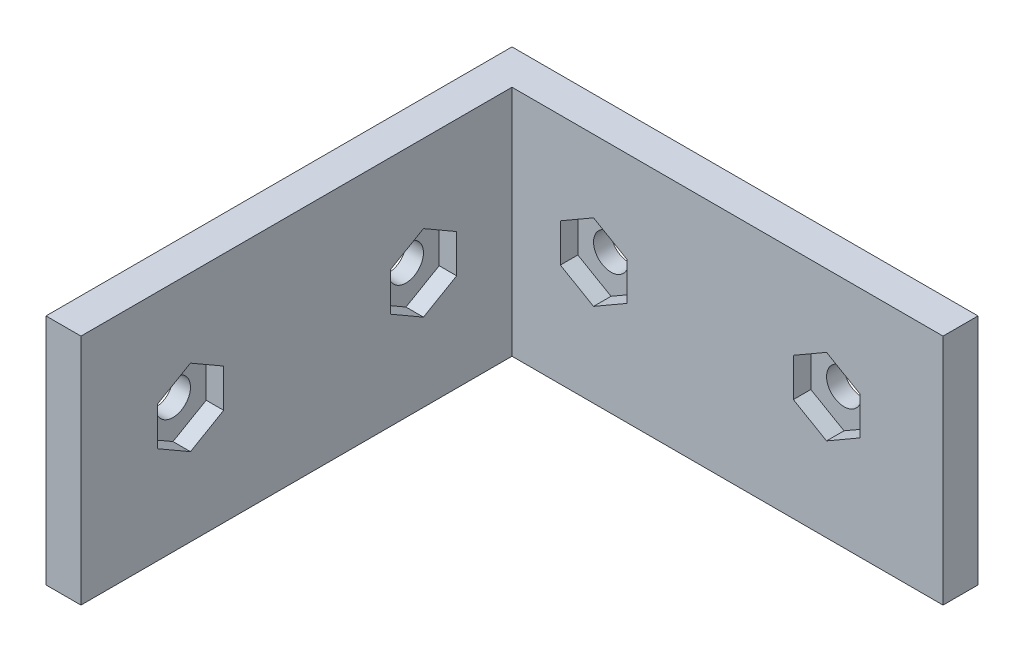
ISO-10303-21;
HEADER;
FILE_DESCRIPTION(('STEP AP214'),'2;1');
FILE_NAME('part.step','',(''),(''),'','','');
FILE_SCHEMA(('AUTOMOTIVE_DESIGN { 1 0 10303 214 1 1 1 1 }'));
ENDSEC;
DATA;
#1=APPLICATION_CONTEXT('core data for automotive mechanical design processes');
#2=APPLICATION_PROTOCOL_DEFINITION('international standard','automotive_design',2000,#1);
#3=PRODUCT_CONTEXT('',#1,'mechanical');
#4=PRODUCT('Part','Part','',(#3));
#5=PRODUCT_RELATED_PRODUCT_CATEGORY('part','',(#4));
#6=PRODUCT_DEFINITION_FORMATION('','',#4);
#7=PRODUCT_DEFINITION_CONTEXT('part definition',#1,'design');
#8=PRODUCT_DEFINITION('design','',#6,#7);
#9=PRODUCT_DEFINITION_SHAPE('','',#8);
#10=(LENGTH_UNIT() NAMED_UNIT(*) SI_UNIT(.MILLI.,.METRE.));
#11=(NAMED_UNIT(*) PLANE_ANGLE_UNIT() SI_UNIT($,.RADIAN.));
#12=(NAMED_UNIT(*) SI_UNIT($,.STERADIAN.) SOLID_ANGLE_UNIT());
#13=UNCERTAINTY_MEASURE_WITH_UNIT(LENGTH_MEASURE(1.E-05),#10,'distance_accuracy_value','');
#14=(GEOMETRIC_REPRESENTATION_CONTEXT(3) GLOBAL_UNCERTAINTY_ASSIGNED_CONTEXT((#13)) GLOBAL_UNIT_ASSIGNED_CONTEXT((#10,
#11,#12)) REPRESENTATION_CONTEXT('',''));
#15=CARTESIAN_POINT('',(0.,0.,0.));
#16=DIRECTION('',(0.,0.,1.));
#17=DIRECTION('',(1.,0.,0.));
#18=AXIS2_PLACEMENT_3D('',#15,#16,#17);
#19=CARTESIAN_POINT('',(10.,10.5,0.));
#20=DIRECTION('',(0.,0.,1.));
#21=DIRECTION('',(1.,0.,0.));
#22=AXIS2_PLACEMENT_3D('',#19,#20,#21);
#23=CYLINDRICAL_SURFACE('',#22,1.5);
#24=CARTESIAN_POINT('',(10.,10.5,0.));
#25=DIRECTION('',(0.,0.,1.));
#26=DIRECTION('',(1.,0.,0.));
#27=AXIS2_PLACEMENT_3D('',#24,#25,#26);
#28=CIRCLE('',#27,1.5);
#29=CARTESIAN_POINT('',(11.5,10.5,0.));
#30=VERTEX_POINT('',#29);
#31=EDGE_CURVE('E460',#30,#30,#28,.T.);
#32=ORIENTED_EDGE('',*,*,#31,.F.);
#33=EDGE_LOOP('',(#32));
#34=FACE_BOUND('',#33,.T.);
#35=CARTESIAN_POINT('',(10.,10.5,1.5));
#36=DIRECTION('',(0.,0.,1.));
#37=DIRECTION('',(1.,0.,0.));
#38=AXIS2_PLACEMENT_3D('',#35,#36,#37);
#39=CIRCLE('',#38,1.5);
#40=CARTESIAN_POINT('',(11.5,10.5,1.5));
#41=VERTEX_POINT('',#40);
#42=EDGE_CURVE('E37',#41,#41,#39,.F.);
#43=ORIENTED_EDGE('',*,*,#42,.F.);
#44=EDGE_LOOP('',(#43));
#45=FACE_BOUND('',#44,.T.);
#46=ADVANCED_FACE('F33',(#34,#45),#23,.F.);
#47=CARTESIAN_POINT('',(30.,10.5,0.));
#48=DIRECTION('',(0.,0.,1.));
#49=DIRECTION('',(1.,0.,0.));
#50=AXIS2_PLACEMENT_3D('',#47,#48,#49);
#51=CYLINDRICAL_SURFACE('',#50,1.5);
#52=CARTESIAN_POINT('',(30.,10.5,0.));
#53=DIRECTION('',(0.,0.,1.));
#54=DIRECTION('',(1.,0.,0.));
#55=AXIS2_PLACEMENT_3D('',#52,#53,#54);
#56=CIRCLE('',#55,1.5);
#57=CARTESIAN_POINT('',(31.5,10.5,0.));
#58=VERTEX_POINT('',#57);
#59=EDGE_CURVE('E457',#58,#58,#56,.T.);
#60=ORIENTED_EDGE('',*,*,#59,.F.);
#61=EDGE_LOOP('',(#60));
#62=FACE_BOUND('',#61,.T.);
#63=CARTESIAN_POINT('',(30.,10.5,1.5));
#64=DIRECTION('',(0.,0.,1.));
#65=DIRECTION('',(1.,0.,0.));
#66=AXIS2_PLACEMENT_3D('',#63,#64,#65);
#67=CIRCLE('',#66,1.5);
#68=CARTESIAN_POINT('',(31.5,10.5,1.5));
#69=VERTEX_POINT('',#68);
#70=EDGE_CURVE('E324',#69,#69,#67,.F.);
#71=ORIENTED_EDGE('',*,*,#70,.F.);
#72=EDGE_LOOP('',(#71));
#73=FACE_BOUND('',#72,.T.);
#74=ADVANCED_FACE('F494',(#62,#73),#51,.F.);
#75=CARTESIAN_POINT('',(3.,10.,30.6));
#76=DIRECTION('',(-1.,0.,0.));
#77=DIRECTION('',(0.,0.,1.));
#78=AXIS2_PLACEMENT_3D('',#75,#76,#77);
#79=CYLINDRICAL_SURFACE('',#78,1.5);
#80=CARTESIAN_POINT('',(0.,10.,30.6));
#81=DIRECTION('',(-1.,0.,0.));
#82=DIRECTION('',(0.,0.,1.));
#83=AXIS2_PLACEMENT_3D('',#80,#81,#82);
#84=CIRCLE('',#83,1.5);
#85=CARTESIAN_POINT('',(0.,10.,32.1));
#86=VERTEX_POINT('',#85);
#87=EDGE_CURVE('E432',#86,#86,#84,.T.);
#88=ORIENTED_EDGE('',*,*,#87,.T.);
#89=EDGE_LOOP('',(#88));
#90=FACE_BOUND('',#89,.T.);
#91=CARTESIAN_POINT('',(1.5,10.,30.6));
#92=DIRECTION('',(1.,0.,0.));
#93=DIRECTION('',(0.,1.,0.));
#94=AXIS2_PLACEMENT_3D('',#91,#92,#93);
#95=CIRCLE('',#94,1.5);
#96=CARTESIAN_POINT('',(1.5,11.5,30.6));
#97=VERTEX_POINT('',#96);
#98=EDGE_CURVE('E372',#97,#97,#95,.F.);
#99=ORIENTED_EDGE('',*,*,#98,.F.);
#100=EDGE_LOOP('',(#99));
#101=FACE_BOUND('',#100,.T.);
#102=ADVANCED_FACE('F496',(#90,#101),#79,.F.);
#103=CARTESIAN_POINT('',(3.,10.,10.6));
#104=DIRECTION('',(-1.,0.,0.));
#105=DIRECTION('',(0.,0.,1.));
#106=AXIS2_PLACEMENT_3D('',#103,#104,#105);
#107=CYLINDRICAL_SURFACE('',#106,1.5);
#108=CARTESIAN_POINT('',(0.,10.,10.6));
#109=DIRECTION('',(-1.,0.,0.));
#110=DIRECTION('',(0.,0.,1.));
#111=AXIS2_PLACEMENT_3D('',#108,#109,#110);
#112=CIRCLE('',#111,1.5);
#113=CARTESIAN_POINT('',(0.,10.,12.1));
#114=VERTEX_POINT('',#113);
#115=EDGE_CURVE('E435',#114,#114,#112,.T.);
#116=ORIENTED_EDGE('',*,*,#115,.T.);
#117=EDGE_LOOP('',(#116));
#118=FACE_BOUND('',#117,.T.);
#119=CARTESIAN_POINT('',(1.5,10.,10.6));
#120=DIRECTION('',(1.,0.,0.));
#121=DIRECTION('',(0.,0.,-1.));
#122=AXIS2_PLACEMENT_3D('',#119,#120,#121);
#123=CIRCLE('',#122,1.5);
#124=CARTESIAN_POINT('',(1.5,10.,9.1));
#125=VERTEX_POINT('',#124);
#126=EDGE_CURVE('E421',#125,#125,#123,.F.);
#127=ORIENTED_EDGE('',*,*,#126,.F.);
#128=EDGE_LOOP('',(#127));
#129=FACE_BOUND('',#128,.T.);
#130=ADVANCED_FACE('F504',(#118,#129),#107,.F.);
#131=CARTESIAN_POINT('',(0.,0.,3.));
#132=DIRECTION('',(0.,0.,-1.));
#133=DIRECTION('',(-1.,0.,0.));
#134=AXIS2_PLACEMENT_3D('',#131,#132,#133);
#135=PLANE('',#134);
#136=DIRECTION('',(0.866025403784439,0.5,0.));
#137=VECTOR('',#136,1.);
#138=CARTESIAN_POINT('',(10.,7.20910346561913,3.));
#139=LINE('',#138,#137);
#140=CARTESIAN_POINT('',(10.,7.20910346561913,3.));
#141=VERTEX_POINT('',#140);
#142=CARTESIAN_POINT('',(12.85,8.85455173280957,3.));
#143=VERTEX_POINT('',#142);
#144=EDGE_CURVE('E268',#141,#143,#139,.T.);
#145=ORIENTED_EDGE('',*,*,#144,.F.);
#146=DIRECTION('',(0.866025403784439,-0.5,0.));
#147=VECTOR('',#146,1.);
#148=CARTESIAN_POINT('',(7.15,8.85455173280957,3.));
#149=LINE('',#148,#147);
#150=CARTESIAN_POINT('',(7.15,8.85455173280957,3.));
#151=VERTEX_POINT('',#150);
#152=EDGE_CURVE('E50',#151,#141,#149,.T.);
#153=ORIENTED_EDGE('',*,*,#152,.F.);
#154=DIRECTION('',(0.,-1.,0.));
#155=VECTOR('',#154,1.);
#156=CARTESIAN_POINT('',(7.15,12.1454482671904,3.));
#157=LINE('',#156,#155);
#158=CARTESIAN_POINT('',(7.15,12.1454482671904,3.));
#159=VERTEX_POINT('',#158);
#160=EDGE_CURVE('E254',#159,#151,#157,.T.);
#161=ORIENTED_EDGE('',*,*,#160,.F.);
#162=DIRECTION('',(-0.866025403784439,-0.5,0.));
#163=VECTOR('',#162,1.);
#164=CARTESIAN_POINT('',(10.,13.7908965343809,3.));
#165=LINE('',#164,#163);
#166=CARTESIAN_POINT('',(10.,13.7908965343809,3.));
#167=VERTEX_POINT('',#166);
#168=EDGE_CURVE('E257',#167,#159,#165,.T.);
#169=ORIENTED_EDGE('',*,*,#168,.F.);
#170=DIRECTION('',(-0.866025403784439,0.5,0.));
#171=VECTOR('',#170,1.);
#172=CARTESIAN_POINT('',(12.85,12.1454482671904,3.));
#173=LINE('',#172,#171);
#174=CARTESIAN_POINT('',(12.85,12.1454482671904,3.));
#175=VERTEX_POINT('',#174);
#176=EDGE_CURVE('E273',#175,#167,#173,.T.);
#177=ORIENTED_EDGE('',*,*,#176,.F.);
#178=DIRECTION('',(0.,1.,0.));
#179=VECTOR('',#178,1.);
#180=CARTESIAN_POINT('',(12.85,8.85455173280957,3.));
#181=LINE('',#180,#179);
#182=EDGE_CURVE('E270',#143,#175,#181,.T.);
#183=ORIENTED_EDGE('',*,*,#182,.F.);
#184=EDGE_LOOP('',(#145,#153,#161,#169,#177,#183));
#185=FACE_BOUND('',#184,.T.);
#186=DIRECTION('',(0.866025403784439,-0.5,0.));
#187=VECTOR('',#186,1.);
#188=CARTESIAN_POINT('',(27.15,8.85455173280957,3.));
#189=LINE('',#188,#187);
#190=CARTESIAN_POINT('',(27.15,8.85455173280957,3.));
#191=VERTEX_POINT('',#190);
#192=CARTESIAN_POINT('',(30.,7.20910346561913,3.));
#193=VERTEX_POINT('',#192);
#194=EDGE_CURVE('E308',#191,#193,#189,.T.);
#195=ORIENTED_EDGE('',*,*,#194,.F.);
#196=DIRECTION('',(0.,-1.,0.));
#197=VECTOR('',#196,1.);
#198=CARTESIAN_POINT('',(27.15,12.1454482671904,3.));
#199=LINE('',#198,#197);
#200=CARTESIAN_POINT('',(27.15,12.1454482671904,3.));
#201=VERTEX_POINT('',#200);
#202=EDGE_CURVE('E58',#201,#191,#199,.T.);
#203=ORIENTED_EDGE('',*,*,#202,.F.);
#204=DIRECTION('',(-0.866025403784438,-0.5,0.));
#205=VECTOR('',#204,1.);
#206=CARTESIAN_POINT('',(30.,13.7908965343809,3.));
#207=LINE('',#206,#205);
#208=CARTESIAN_POINT('',(30.,13.7908965343809,3.));
#209=VERTEX_POINT('',#208);
#210=EDGE_CURVE('E291',#209,#201,#207,.T.);
#211=ORIENTED_EDGE('',*,*,#210,.F.);
#212=DIRECTION('',(-0.866025403784439,0.5,0.));
#213=VECTOR('',#212,1.);
#214=CARTESIAN_POINT('',(32.85,12.1454482671904,3.));
#215=LINE('',#214,#213);
#216=CARTESIAN_POINT('',(32.85,12.1454482671904,3.));
#217=VERTEX_POINT('',#216);
#218=EDGE_CURVE('E317',#217,#209,#215,.T.);
#219=ORIENTED_EDGE('',*,*,#218,.F.);
#220=DIRECTION('',(0.,1.,0.));
#221=VECTOR('',#220,1.);
#222=CARTESIAN_POINT('',(32.85,8.85455173280957,3.));
#223=LINE('',#222,#221);
#224=CARTESIAN_POINT('',(32.85,8.85455173280957,3.));
#225=VERTEX_POINT('',#224);
#226=EDGE_CURVE('E314',#225,#217,#223,.T.);
#227=ORIENTED_EDGE('',*,*,#226,.F.);
#228=DIRECTION('',(0.866025403784439,0.5,0.));
#229=VECTOR('',#228,1.);
#230=CARTESIAN_POINT('',(30.,7.20910346561913,3.));
#231=LINE('',#230,#229);
#232=EDGE_CURVE('E311',#193,#225,#231,.T.);
#233=ORIENTED_EDGE('',*,*,#232,.F.);
#234=EDGE_LOOP('',(#195,#203,#211,#219,#227,#233));
#235=FACE_BOUND('',#234,.T.);
#236=DIRECTION('',(0.,1.,0.));
#237=VECTOR('',#236,1.);
#238=CARTESIAN_POINT('',(3.,20.,3.));
#239=LINE('',#238,#237);
#240=CARTESIAN_POINT('',(3.,0.,3.));
#241=VERTEX_POINT('',#240);
#242=CARTESIAN_POINT('',(3.,20.,3.));
#243=VERTEX_POINT('',#242);
#244=EDGE_CURVE('E438',#241,#243,#239,.T.);
#245=ORIENTED_EDGE('',*,*,#244,.F.);
#246=DIRECTION('',(1.,0.,0.));
#247=VECTOR('',#246,1.);
#248=CARTESIAN_POINT('',(0.,0.,3.));
#249=LINE('',#248,#247);
#250=CARTESIAN_POINT('',(40.,0.,3.));
#251=VERTEX_POINT('',#250);
#252=EDGE_CURVE('E464',#241,#251,#249,.T.);
#253=ORIENTED_EDGE('',*,*,#252,.T.);
#254=DIRECTION('',(0.,1.,0.));
#255=VECTOR('',#254,1.);
#256=CARTESIAN_POINT('',(40.,0.,3.));
#257=LINE('',#256,#255);
#258=CARTESIAN_POINT('',(40.,20.,3.));
#259=VERTEX_POINT('',#258);
#260=EDGE_CURVE('E466',#251,#259,#257,.T.);
#261=ORIENTED_EDGE('',*,*,#260,.T.);
#262=DIRECTION('',(-1.,0.,0.));
#263=VECTOR('',#262,1.);
#264=CARTESIAN_POINT('',(0.,20.,3.));
#265=LINE('',#264,#263);
#266=EDGE_CURVE('E469',#259,#243,#265,.T.);
#267=ORIENTED_EDGE('',*,*,#266,.T.);
#268=EDGE_LOOP('',(#245,#253,#261,#267));
#269=FACE_BOUND('',#268,.T.);
#270=ADVANCED_FACE('F514',(#185,#235,#269),#135,.F.);
#271=CARTESIAN_POINT('',(0.,0.,3.));
#272=DIRECTION('',(1.,0.,0.));
#273=DIRECTION('',(0.,0.,-1.));
#274=AXIS2_PLACEMENT_3D('',#271,#272,#273);
#275=PLANE('',#274);
#276=ORIENTED_EDGE('',*,*,#87,.F.);
#277=EDGE_LOOP('',(#276));
#278=FACE_BOUND('',#277,.T.);
#279=ORIENTED_EDGE('',*,*,#115,.F.);
#280=EDGE_LOOP('',(#279));
#281=FACE_BOUND('',#280,.T.);
#282=DIRECTION('',(0.,-1.,0.));
#283=VECTOR('',#282,1.);
#284=CARTESIAN_POINT('',(0.,0.,0.));
#285=LINE('',#284,#283);
#286=CARTESIAN_POINT('',(0.,20.,0.));
#287=VERTEX_POINT('',#286);
#288=CARTESIAN_POINT('',(0.,0.,0.));
#289=VERTEX_POINT('',#288);
#290=EDGE_CURVE('E463',#287,#289,#285,.T.);
#291=ORIENTED_EDGE('',*,*,#290,.T.);
#292=DIRECTION('',(0.,0.,-1.));
#293=VECTOR('',#292,1.);
#294=CARTESIAN_POINT('',(0.,0.,3.));
#295=LINE('',#294,#293);
#296=CARTESIAN_POINT('',(0.,0.,40.));
#297=VERTEX_POINT('',#296);
#298=EDGE_CURVE('E11',#297,#289,#295,.T.);
#299=ORIENTED_EDGE('',*,*,#298,.F.);
#300=DIRECTION('',(0.,-1.,0.));
#301=VECTOR('',#300,1.);
#302=CARTESIAN_POINT('',(0.,20.,40.));
#303=LINE('',#302,#301);
#304=CARTESIAN_POINT('',(0.,20.,40.));
#305=VERTEX_POINT('',#304);
#306=EDGE_CURVE('E439',#305,#297,#303,.T.);
#307=ORIENTED_EDGE('',*,*,#306,.F.);
#308=DIRECTION('',(0.,0.,-1.));
#309=VECTOR('',#308,1.);
#310=CARTESIAN_POINT('',(0.,20.,3.));
#311=LINE('',#310,#309);
#312=EDGE_CURVE('E471',#305,#287,#311,.T.);
#313=ORIENTED_EDGE('',*,*,#312,.T.);
#314=EDGE_LOOP('',(#291,#299,#307,#313));
#315=FACE_BOUND('',#314,.T.);
#316=ADVANCED_FACE('F35',(#278,#281,#315),#275,.F.);
#317=CARTESIAN_POINT('',(0.,0.,3.));
#318=DIRECTION('',(0.,1.,0.));
#319=DIRECTION('',(0.,0.,1.));
#320=AXIS2_PLACEMENT_3D('',#317,#318,#319);
#321=PLANE('',#320);
#322=DIRECTION('',(1.,0.,0.));
#323=VECTOR('',#322,1.);
#324=CARTESIAN_POINT('',(0.,0.,0.));
#325=LINE('',#324,#323);
#326=CARTESIAN_POINT('',(40.,0.,0.));
#327=VERTEX_POINT('',#326);
#328=EDGE_CURVE('E474',#289,#327,#325,.T.);
#329=ORIENTED_EDGE('',*,*,#328,.T.);
#330=DIRECTION('',(0.,0.,-1.));
#331=VECTOR('',#330,1.);
#332=CARTESIAN_POINT('',(40.,0.,3.));
#333=LINE('',#332,#331);
#334=EDGE_CURVE('E42',#251,#327,#333,.T.);
#335=ORIENTED_EDGE('',*,*,#334,.F.);
#336=ORIENTED_EDGE('',*,*,#252,.F.);
#337=DIRECTION('',(0.,0.,-1.));
#338=VECTOR('',#337,1.);
#339=CARTESIAN_POINT('',(3.,0.,40.));
#340=LINE('',#339,#338);
#341=CARTESIAN_POINT('',(3.,0.,40.));
#342=VERTEX_POINT('',#341);
#343=EDGE_CURVE('E454',#342,#241,#340,.T.);
#344=ORIENTED_EDGE('',*,*,#343,.F.);
#345=DIRECTION('',(1.,0.,0.));
#346=VECTOR('',#345,1.);
#347=CARTESIAN_POINT('',(0.,0.,40.));
#348=LINE('',#347,#346);
#349=EDGE_CURVE('E442',#297,#342,#348,.T.);
#350=ORIENTED_EDGE('',*,*,#349,.F.);
#351=ORIENTED_EDGE('',*,*,#298,.T.);
#352=EDGE_LOOP('',(#329,#335,#336,#344,#350,#351));
#353=FACE_BOUND('',#352,.T.);
#354=ADVANCED_FACE('F527',(#353),#321,.F.);
#355=CARTESIAN_POINT('',(40.,0.,3.));
#356=DIRECTION('',(-1.,0.,0.));
#357=DIRECTION('',(0.,0.,1.));
#358=AXIS2_PLACEMENT_3D('',#355,#356,#357);
#359=PLANE('',#358);
#360=DIRECTION('',(0.,1.,0.));
#361=VECTOR('',#360,1.);
#362=CARTESIAN_POINT('',(40.,0.,0.));
#363=LINE('',#362,#361);
#364=CARTESIAN_POINT('',(40.,20.,0.));
#365=VERTEX_POINT('',#364);
#366=EDGE_CURVE('E476',#327,#365,#363,.T.);
#367=ORIENTED_EDGE('',*,*,#366,.T.);
#368=DIRECTION('',(0.,0.,-1.));
#369=VECTOR('',#368,1.);
#370=CARTESIAN_POINT('',(40.,20.,3.));
#371=LINE('',#370,#369);
#372=EDGE_CURVE('E481',#259,#365,#371,.T.);
#373=ORIENTED_EDGE('',*,*,#372,.F.);
#374=ORIENTED_EDGE('',*,*,#260,.F.);
#375=ORIENTED_EDGE('',*,*,#334,.T.);
#376=EDGE_LOOP('',(#367,#373,#374,#375));
#377=FACE_BOUND('',#376,.T.);
#378=ADVANCED_FACE('F524',(#377),#359,.F.);
#379=CARTESIAN_POINT('',(0.,20.,3.));
#380=DIRECTION('',(0.,-1.,0.));
#381=DIRECTION('',(0.,0.,-1.));
#382=AXIS2_PLACEMENT_3D('',#379,#380,#381);
#383=PLANE('',#382);
#384=DIRECTION('',(-1.,0.,0.));
#385=VECTOR('',#384,1.);
#386=CARTESIAN_POINT('',(0.,20.,0.));
#387=LINE('',#386,#385);
#388=EDGE_CURVE('E467',#365,#287,#387,.T.);
#389=ORIENTED_EDGE('',*,*,#388,.T.);
#390=ORIENTED_EDGE('',*,*,#312,.F.);
#391=DIRECTION('',(-1.,0.,0.));
#392=VECTOR('',#391,1.);
#393=CARTESIAN_POINT('',(0.,20.,40.));
#394=LINE('',#393,#392);
#395=CARTESIAN_POINT('',(3.,20.,40.));
#396=VERTEX_POINT('',#395);
#397=EDGE_CURVE('E446',#396,#305,#394,.T.);
#398=ORIENTED_EDGE('',*,*,#397,.F.);
#399=DIRECTION('',(0.,0.,-1.));
#400=VECTOR('',#399,1.);
#401=CARTESIAN_POINT('',(3.,20.,40.));
#402=LINE('',#401,#400);
#403=EDGE_CURVE('E449',#396,#243,#402,.T.);
#404=ORIENTED_EDGE('',*,*,#403,.T.);
#405=ORIENTED_EDGE('',*,*,#266,.F.);
#406=ORIENTED_EDGE('',*,*,#372,.T.);
#407=EDGE_LOOP('',(#389,#390,#398,#404,#405,#406));
#408=FACE_BOUND('',#407,.T.);
#409=ADVANCED_FACE('F520',(#408),#383,.F.);
#410=CARTESIAN_POINT('',(0.,0.,0.));
#411=DIRECTION('',(0.,0.,-1.));
#412=DIRECTION('',(-1.,0.,0.));
#413=AXIS2_PLACEMENT_3D('',#410,#411,#412);
#414=PLANE('',#413);
#415=ORIENTED_EDGE('',*,*,#59,.T.);
#416=EDGE_LOOP('',(#415));
#417=FACE_BOUND('',#416,.T.);
#418=ORIENTED_EDGE('',*,*,#31,.T.);
#419=EDGE_LOOP('',(#418));
#420=FACE_BOUND('',#419,.T.);
#421=ORIENTED_EDGE('',*,*,#290,.F.);
#422=ORIENTED_EDGE('',*,*,#388,.F.);
#423=ORIENTED_EDGE('',*,*,#366,.F.);
#424=ORIENTED_EDGE('',*,*,#328,.F.);
#425=EDGE_LOOP('',(#421,#422,#423,#424));
#426=FACE_BOUND('',#425,.T.);
#427=ADVANCED_FACE('F517',(#417,#420,#426),#414,.T.);
#428=CARTESIAN_POINT('',(3.,20.,40.));
#429=DIRECTION('',(-1.,0.,0.));
#430=DIRECTION('',(0.,-1.,0.));
#431=AXIS2_PLACEMENT_3D('',#428,#429,#430);
#432=PLANE('',#431);
#433=DIRECTION('',(0.,0.5,-0.866025403784439));
#434=VECTOR('',#433,1.);
#435=CARTESIAN_POINT('',(3.,6.70910346561913,30.6));
#436=LINE('',#435,#434);
#437=CARTESIAN_POINT('',(3.,6.70910346561912,30.6));
#438=VERTEX_POINT('',#437);
#439=CARTESIAN_POINT('',(3.,8.35455173280956,27.75));
#440=VERTEX_POINT('',#439);
#441=EDGE_CURVE('E356',#438,#440,#436,.T.);
#442=ORIENTED_EDGE('',*,*,#441,.F.);
#443=DIRECTION('',(0.,-0.5,-0.866025403784439));
#444=VECTOR('',#443,1.);
#445=CARTESIAN_POINT('',(3.,8.35455173280956,33.45));
#446=LINE('',#445,#444);
#447=CARTESIAN_POINT('',(3.,8.35455173280956,33.45));
#448=VERTEX_POINT('',#447);
#449=EDGE_CURVE('E354',#448,#438,#446,.T.);
#450=ORIENTED_EDGE('',*,*,#449,.F.);
#451=DIRECTION('',(0.,-1.,0.));
#452=VECTOR('',#451,1.);
#453=CARTESIAN_POINT('',(3.,11.6454482671904,33.45));
#454=LINE('',#453,#452);
#455=CARTESIAN_POINT('',(3.,11.6454482671904,33.45));
#456=VERTEX_POINT('',#455);
#457=EDGE_CURVE('E338',#456,#448,#454,.T.);
#458=ORIENTED_EDGE('',*,*,#457,.F.);
#459=DIRECTION('',(0.,-0.5,0.866025403784439));
#460=VECTOR('',#459,1.);
#461=CARTESIAN_POINT('',(3.,13.2908965343809,30.6));
#462=LINE('',#461,#460);
#463=CARTESIAN_POINT('',(3.,13.2908965343809,30.6));
#464=VERTEX_POINT('',#463);
#465=EDGE_CURVE('E365',#464,#456,#462,.T.);
#466=ORIENTED_EDGE('',*,*,#465,.F.);
#467=DIRECTION('',(0.,0.5,0.866025403784439));
#468=VECTOR('',#467,1.);
#469=CARTESIAN_POINT('',(3.,11.6454482671904,27.75));
#470=LINE('',#469,#468);
#471=CARTESIAN_POINT('',(3.,11.6454482671904,27.75));
#472=VERTEX_POINT('',#471);
#473=EDGE_CURVE('E362',#472,#464,#470,.T.);
#474=ORIENTED_EDGE('',*,*,#473,.F.);
#475=DIRECTION('',(0.,1.,0.));
#476=VECTOR('',#475,1.);
#477=CARTESIAN_POINT('',(3.,8.35455173280956,27.75));
#478=LINE('',#477,#476);
#479=EDGE_CURVE('E359',#440,#472,#478,.T.);
#480=ORIENTED_EDGE('',*,*,#479,.F.);
#481=EDGE_LOOP('',(#442,#450,#458,#466,#474,#480));
#482=FACE_BOUND('',#481,.T.);
#483=DIRECTION('',(0.,-0.5,-0.866025403784438));
#484=VECTOR('',#483,1.);
#485=CARTESIAN_POINT('',(3.,8.35455173280957,13.45));
#486=LINE('',#485,#484);
#487=CARTESIAN_POINT('',(3.,8.35455173280956,13.45));
#488=VERTEX_POINT('',#487);
#489=CARTESIAN_POINT('',(3.,6.70910346561913,10.6));
#490=VERTEX_POINT('',#489);
#491=EDGE_CURVE('E405',#488,#490,#486,.T.);
#492=ORIENTED_EDGE('',*,*,#491,.F.);
#493=DIRECTION('',(0.,-1.,0.));
#494=VECTOR('',#493,1.);
#495=CARTESIAN_POINT('',(3.,11.6454482671904,13.45));
#496=LINE('',#495,#494);
#497=CARTESIAN_POINT('',(3.,11.6454482671904,13.45));
#498=VERTEX_POINT('',#497);
#499=EDGE_CURVE('E403',#498,#488,#496,.T.);
#500=ORIENTED_EDGE('',*,*,#499,.F.);
#501=DIRECTION('',(0.,-0.5,0.866025403784439));
#502=VECTOR('',#501,1.);
#503=CARTESIAN_POINT('',(3.,13.2908965343809,10.6));
#504=LINE('',#503,#502);
#505=CARTESIAN_POINT('',(3.,13.2908965343809,10.6));
#506=VERTEX_POINT('',#505);
#507=EDGE_CURVE('E387',#506,#498,#504,.T.);
#508=ORIENTED_EDGE('',*,*,#507,.F.);
#509=DIRECTION('',(0.,0.5,0.866025403784439));
#510=VECTOR('',#509,1.);
#511=CARTESIAN_POINT('',(3.,11.6454482671904,7.75));
#512=LINE('',#511,#510);
#513=CARTESIAN_POINT('',(3.,11.6454482671904,7.75));
#514=VERTEX_POINT('',#513);
#515=EDGE_CURVE('E414',#514,#506,#512,.T.);
#516=ORIENTED_EDGE('',*,*,#515,.F.);
#517=DIRECTION('',(0.,1.,0.));
#518=VECTOR('',#517,1.);
#519=CARTESIAN_POINT('',(3.,8.35455173280957,7.75));
#520=LINE('',#519,#518);
#521=CARTESIAN_POINT('',(3.,8.35455173280957,7.75));
#522=VERTEX_POINT('',#521);
#523=EDGE_CURVE('E411',#522,#514,#520,.T.);
#524=ORIENTED_EDGE('',*,*,#523,.F.);
#525=DIRECTION('',(0.,0.5,-0.866025403784439));
#526=VECTOR('',#525,1.);
#527=CARTESIAN_POINT('',(3.,6.70910346561913,10.6));
#528=LINE('',#527,#526);
#529=EDGE_CURVE('E408',#490,#522,#528,.T.);
#530=ORIENTED_EDGE('',*,*,#529,.F.);
#531=EDGE_LOOP('',(#492,#500,#508,#516,#524,#530));
#532=FACE_BOUND('',#531,.T.);
#533=ORIENTED_EDGE('',*,*,#244,.T.);
#534=ORIENTED_EDGE('',*,*,#403,.F.);
#535=DIRECTION('',(0.,1.,0.));
#536=VECTOR('',#535,1.);
#537=CARTESIAN_POINT('',(3.,20.,40.));
#538=LINE('',#537,#536);
#539=EDGE_CURVE('E444',#342,#396,#538,.T.);
#540=ORIENTED_EDGE('',*,*,#539,.F.);
#541=ORIENTED_EDGE('',*,*,#343,.T.);
#542=EDGE_LOOP('',(#533,#534,#540,#541));
#543=FACE_BOUND('',#542,.T.);
#544=ADVANCED_FACE('F511',(#482,#532,#543),#432,.F.);
#545=CARTESIAN_POINT('',(0.,0.,40.));
#546=DIRECTION('',(0.,0.,1.));
#547=DIRECTION('',(1.,0.,0.));
#548=AXIS2_PLACEMENT_3D('',#545,#546,#547);
#549=PLANE('',#548);
#550=ORIENTED_EDGE('',*,*,#306,.T.);
#551=ORIENTED_EDGE('',*,*,#349,.T.);
#552=ORIENTED_EDGE('',*,*,#539,.T.);
#553=ORIENTED_EDGE('',*,*,#397,.T.);
#554=EDGE_LOOP('',(#550,#551,#552,#553));
#555=FACE_BOUND('',#554,.T.);
#556=ADVANCED_FACE('F549',(#555),#549,.T.);
#557=CARTESIAN_POINT('',(1.5,0.,0.));
#558=DIRECTION('',(1.,0.,0.));
#559=DIRECTION('',(0.,0.,-1.));
#560=AXIS2_PLACEMENT_3D('',#557,#558,#559);
#561=PLANE('',#560);
#562=DIRECTION('',(0.,-1.,0.));
#563=VECTOR('',#562,1.);
#564=CARTESIAN_POINT('',(1.5,11.6454482671904,13.45));
#565=LINE('',#564,#563);
#566=CARTESIAN_POINT('',(1.5,11.6454482671904,13.45));
#567=VERTEX_POINT('',#566);
#568=CARTESIAN_POINT('',(1.5,8.35455173280957,13.45));
#569=VERTEX_POINT('',#568);
#570=EDGE_CURVE('E383',#567,#569,#565,.T.);
#571=ORIENTED_EDGE('',*,*,#570,.T.);
#572=DIRECTION('',(0.,-0.5,-0.866025403784438));
#573=VECTOR('',#572,1.);
#574=CARTESIAN_POINT('',(1.5,8.35455173280957,13.45));
#575=LINE('',#574,#573);
#576=CARTESIAN_POINT('',(1.5,6.70910346561913,10.6));
#577=VERTEX_POINT('',#576);
#578=EDGE_CURVE('E386',#569,#577,#575,.T.);
#579=ORIENTED_EDGE('',*,*,#578,.T.);
#580=DIRECTION('',(0.,0.5,-0.866025403784439));
#581=VECTOR('',#580,1.);
#582=CARTESIAN_POINT('',(1.5,6.70910346561913,10.6));
#583=LINE('',#582,#581);
#584=CARTESIAN_POINT('',(1.5,8.35455173280957,7.75));
#585=VERTEX_POINT('',#584);
#586=EDGE_CURVE('E390',#577,#585,#583,.T.);
#587=ORIENTED_EDGE('',*,*,#586,.T.);
#588=DIRECTION('',(0.,1.,0.));
#589=VECTOR('',#588,1.);
#590=CARTESIAN_POINT('',(1.5,8.35455173280957,7.75));
#591=LINE('',#590,#589);
#592=CARTESIAN_POINT('',(1.5,11.6454482671904,7.75));
#593=VERTEX_POINT('',#592);
#594=EDGE_CURVE('E393',#585,#593,#591,.T.);
#595=ORIENTED_EDGE('',*,*,#594,.T.);
#596=DIRECTION('',(0.,0.5,0.866025403784439));
#597=VECTOR('',#596,1.);
#598=CARTESIAN_POINT('',(1.5,11.6454482671904,7.75));
#599=LINE('',#598,#597);
#600=CARTESIAN_POINT('',(1.5,13.2908965343809,10.6));
#601=VERTEX_POINT('',#600);
#602=EDGE_CURVE('E396',#593,#601,#599,.T.);
#603=ORIENTED_EDGE('',*,*,#602,.T.);
#604=DIRECTION('',(0.,-0.5,0.866025403784439));
#605=VECTOR('',#604,1.);
#606=CARTESIAN_POINT('',(1.5,13.2908965343809,10.6));
#607=LINE('',#606,#605);
#608=EDGE_CURVE('E399',#601,#567,#607,.T.);
#609=ORIENTED_EDGE('',*,*,#608,.T.);
#610=EDGE_LOOP('',(#571,#579,#587,#595,#603,#609));
#611=FACE_BOUND('',#610,.T.);
#612=ORIENTED_EDGE('',*,*,#126,.T.);
#613=EDGE_LOOP('',(#612));
#614=FACE_BOUND('',#613,.T.);
#615=ADVANCED_FACE('F562',(#611,#614),#561,.T.);
#616=CARTESIAN_POINT('',(1.5,11.6454482671904,13.45));
#617=DIRECTION('',(0.,0.,1.));
#618=DIRECTION('',(1.,0.,0.));
#619=AXIS2_PLACEMENT_3D('',#616,#617,#618);
#620=PLANE('',#619);
#621=ORIENTED_EDGE('',*,*,#499,.T.);
#622=DIRECTION('',(1.,0.,0.));
#623=VECTOR('',#622,1.);
#624=CARTESIAN_POINT('',(1.5,8.35455173280957,13.45));
#625=LINE('',#624,#623);
#626=EDGE_CURVE('E402',#569,#488,#625,.T.);
#627=ORIENTED_EDGE('',*,*,#626,.F.);
#628=ORIENTED_EDGE('',*,*,#570,.F.);
#629=DIRECTION('',(1.,0.,0.));
#630=VECTOR('',#629,1.);
#631=CARTESIAN_POINT('',(1.5,11.6454482671904,13.45));
#632=LINE('',#631,#630);
#633=EDGE_CURVE('E419',#567,#498,#632,.T.);
#634=ORIENTED_EDGE('',*,*,#633,.T.);
#635=EDGE_LOOP('',(#621,#627,#628,#634));
#636=FACE_BOUND('',#635,.T.);
#637=ADVANCED_FACE('F578',(#636),#620,.F.);
#638=CARTESIAN_POINT('',(1.5,13.2908965343809,10.6));
#639=DIRECTION('',(0.,0.866025403784439,0.5));
#640=DIRECTION('',(0.,-0.5,0.866025403784439));
#641=AXIS2_PLACEMENT_3D('',#638,#639,#640);
#642=PLANE('',#641);
#643=ORIENTED_EDGE('',*,*,#507,.T.);
#644=ORIENTED_EDGE('',*,*,#633,.F.);
#645=ORIENTED_EDGE('',*,*,#608,.F.);
#646=DIRECTION('',(1.,0.,0.));
#647=VECTOR('',#646,1.);
#648=CARTESIAN_POINT('',(1.5,13.2908965343809,10.6));
#649=LINE('',#648,#647);
#650=EDGE_CURVE('E422',#601,#506,#649,.T.);
#651=ORIENTED_EDGE('',*,*,#650,.T.);
#652=EDGE_LOOP('',(#643,#644,#645,#651));
#653=FACE_BOUND('',#652,.T.);
#654=ADVANCED_FACE('F581',(#653),#642,.F.);
#655=CARTESIAN_POINT('',(1.5,11.6454482671904,7.75));
#656=DIRECTION('',(0.,0.866025403784439,-0.5));
#657=DIRECTION('',(0.,0.5,0.866025403784439));
#658=AXIS2_PLACEMENT_3D('',#655,#656,#657);
#659=PLANE('',#658);
#660=ORIENTED_EDGE('',*,*,#515,.T.);
#661=ORIENTED_EDGE('',*,*,#650,.F.);
#662=ORIENTED_EDGE('',*,*,#602,.F.);
#663=DIRECTION('',(1.,0.,0.));
#664=VECTOR('',#663,1.);
#665=CARTESIAN_POINT('',(1.5,11.6454482671904,7.75));
#666=LINE('',#665,#664);
#667=EDGE_CURVE('E424',#593,#514,#666,.T.);
#668=ORIENTED_EDGE('',*,*,#667,.T.);
#669=EDGE_LOOP('',(#660,#661,#662,#668));
#670=FACE_BOUND('',#669,.T.);
#671=ADVANCED_FACE('F584',(#670),#659,.F.);
#672=CARTESIAN_POINT('',(1.5,8.35455173280957,7.75));
#673=DIRECTION('',(0.,0.,-1.));
#674=DIRECTION('',(-1.,0.,0.));
#675=AXIS2_PLACEMENT_3D('',#672,#673,#674);
#676=PLANE('',#675);
#677=ORIENTED_EDGE('',*,*,#523,.T.);
#678=ORIENTED_EDGE('',*,*,#667,.F.);
#679=ORIENTED_EDGE('',*,*,#594,.F.);
#680=DIRECTION('',(1.,0.,0.));
#681=VECTOR('',#680,1.);
#682=CARTESIAN_POINT('',(1.5,8.35455173280957,7.75));
#683=LINE('',#682,#681);
#684=EDGE_CURVE('E426',#585,#522,#683,.T.);
#685=ORIENTED_EDGE('',*,*,#684,.T.);
#686=EDGE_LOOP('',(#677,#678,#679,#685));
#687=FACE_BOUND('',#686,.T.);
#688=ADVANCED_FACE('F588',(#687),#676,.F.);
#689=CARTESIAN_POINT('',(1.5,6.70910346561913,10.6));
#690=DIRECTION('',(0.,-0.866025403784438,-0.5));
#691=DIRECTION('',(0.,0.5,-0.866025403784439));
#692=AXIS2_PLACEMENT_3D('',#689,#690,#691);
#693=PLANE('',#692);
#694=ORIENTED_EDGE('',*,*,#529,.T.);
#695=ORIENTED_EDGE('',*,*,#684,.F.);
#696=ORIENTED_EDGE('',*,*,#586,.F.);
#697=DIRECTION('',(1.,0.,0.));
#698=VECTOR('',#697,1.);
#699=CARTESIAN_POINT('',(1.5,6.70910346561913,10.6));
#700=LINE('',#699,#698);
#701=EDGE_CURVE('E428',#577,#490,#700,.T.);
#702=ORIENTED_EDGE('',*,*,#701,.T.);
#703=EDGE_LOOP('',(#694,#695,#696,#702));
#704=FACE_BOUND('',#703,.T.);
#705=ADVANCED_FACE('F590',(#704),#693,.F.);
#706=CARTESIAN_POINT('',(1.5,8.35455173280957,13.45));
#707=DIRECTION('',(0.,-0.866025403784438,0.5));
#708=DIRECTION('',(0.,-0.5,-0.866025403784439));
#709=AXIS2_PLACEMENT_3D('',#706,#707,#708);
#710=PLANE('',#709);
#711=ORIENTED_EDGE('',*,*,#491,.T.);
#712=ORIENTED_EDGE('',*,*,#701,.F.);
#713=ORIENTED_EDGE('',*,*,#578,.F.);
#714=ORIENTED_EDGE('',*,*,#626,.T.);
#715=EDGE_LOOP('',(#711,#712,#713,#714));
#716=FACE_BOUND('',#715,.T.);
#717=ADVANCED_FACE('F573',(#716),#710,.F.);
#718=CARTESIAN_POINT('',(1.5,0.,0.));
#719=DIRECTION('',(1.,0.,0.));
#720=DIRECTION('',(0.,1.,0.));
#721=AXIS2_PLACEMENT_3D('',#718,#719,#720);
#722=PLANE('',#721);
#723=DIRECTION('',(0.,-0.5,-0.866025403784439));
#724=VECTOR('',#723,1.);
#725=CARTESIAN_POINT('',(1.5,8.35455173280956,33.45));
#726=LINE('',#725,#724);
#727=CARTESIAN_POINT('',(1.5,8.35455173280956,33.45));
#728=VERTEX_POINT('',#727);
#729=CARTESIAN_POINT('',(1.5,6.70910346561913,30.6));
#730=VERTEX_POINT('',#729);
#731=EDGE_CURVE('E334',#728,#730,#726,.T.);
#732=ORIENTED_EDGE('',*,*,#731,.T.);
#733=DIRECTION('',(0.,0.5,-0.866025403784439));
#734=VECTOR('',#733,1.);
#735=CARTESIAN_POINT('',(1.5,6.70910346561913,30.6));
#736=LINE('',#735,#734);
#737=CARTESIAN_POINT('',(1.5,8.35455173280956,27.75));
#738=VERTEX_POINT('',#737);
#739=EDGE_CURVE('E337',#730,#738,#736,.T.);
#740=ORIENTED_EDGE('',*,*,#739,.T.);
#741=DIRECTION('',(0.,1.,0.));
#742=VECTOR('',#741,1.);
#743=CARTESIAN_POINT('',(1.5,8.35455173280956,27.75));
#744=LINE('',#743,#742);
#745=CARTESIAN_POINT('',(1.5,11.6454482671904,27.75));
#746=VERTEX_POINT('',#745);
#747=EDGE_CURVE('E341',#738,#746,#744,.T.);
#748=ORIENTED_EDGE('',*,*,#747,.T.);
#749=DIRECTION('',(0.,0.5,0.866025403784439));
#750=VECTOR('',#749,1.);
#751=CARTESIAN_POINT('',(1.5,11.6454482671904,27.75));
#752=LINE('',#751,#750);
#753=CARTESIAN_POINT('',(1.5,13.2908965343809,30.6));
#754=VERTEX_POINT('',#753);
#755=EDGE_CURVE('E344',#746,#754,#752,.T.);
#756=ORIENTED_EDGE('',*,*,#755,.T.);
#757=DIRECTION('',(0.,-0.5,0.866025403784439));
#758=VECTOR('',#757,1.);
#759=CARTESIAN_POINT('',(1.5,13.2908965343809,30.6));
#760=LINE('',#759,#758);
#761=CARTESIAN_POINT('',(1.5,11.6454482671904,33.45));
#762=VERTEX_POINT('',#761);
#763=EDGE_CURVE('E347',#754,#762,#760,.T.);
#764=ORIENTED_EDGE('',*,*,#763,.T.);
#765=DIRECTION('',(0.,-1.,0.));
#766=VECTOR('',#765,1.);
#767=CARTESIAN_POINT('',(1.5,11.6454482671904,33.45));
#768=LINE('',#767,#766);
#769=EDGE_CURVE('E350',#762,#728,#768,.T.);
#770=ORIENTED_EDGE('',*,*,#769,.T.);
#771=EDGE_LOOP('',(#732,#740,#748,#756,#764,#770));
#772=FACE_BOUND('',#771,.T.);
#773=ORIENTED_EDGE('',*,*,#98,.T.);
#774=EDGE_LOOP('',(#773));
#775=FACE_BOUND('',#774,.T.);
#776=ADVANCED_FACE('F606',(#772,#775),#722,.T.);
#777=CARTESIAN_POINT('',(1.5,8.35455173280956,33.45));
#778=DIRECTION('',(0.,-0.866025403784438,0.5));
#779=DIRECTION('',(0.,-0.5,-0.866025403784439));
#780=AXIS2_PLACEMENT_3D('',#777,#778,#779);
#781=PLANE('',#780);
#782=ORIENTED_EDGE('',*,*,#449,.T.);
#783=DIRECTION('',(1.,0.,0.));
#784=VECTOR('',#783,1.);
#785=CARTESIAN_POINT('',(1.5,6.70910346561913,30.6));
#786=LINE('',#785,#784);
#787=EDGE_CURVE('E353',#730,#438,#786,.T.);
#788=ORIENTED_EDGE('',*,*,#787,.F.);
#789=ORIENTED_EDGE('',*,*,#731,.F.);
#790=DIRECTION('',(1.,0.,0.));
#791=VECTOR('',#790,1.);
#792=CARTESIAN_POINT('',(1.5,8.35455173280956,33.45));
#793=LINE('',#792,#791);
#794=EDGE_CURVE('E370',#728,#448,#793,.T.);
#795=ORIENTED_EDGE('',*,*,#794,.T.);
#796=EDGE_LOOP('',(#782,#788,#789,#795));
#797=FACE_BOUND('',#796,.T.);
#798=ADVANCED_FACE('F615',(#797),#781,.F.);
#799=CARTESIAN_POINT('',(1.5,11.6454482671904,33.45));
#800=DIRECTION('',(0.,0.,1.));
#801=DIRECTION('',(1.,0.,0.));
#802=AXIS2_PLACEMENT_3D('',#799,#800,#801);
#803=PLANE('',#802);
#804=ORIENTED_EDGE('',*,*,#457,.T.);
#805=ORIENTED_EDGE('',*,*,#794,.F.);
#806=ORIENTED_EDGE('',*,*,#769,.F.);
#807=DIRECTION('',(1.,0.,0.));
#808=VECTOR('',#807,1.);
#809=CARTESIAN_POINT('',(1.5,11.6454482671904,33.45));
#810=LINE('',#809,#808);
#811=EDGE_CURVE('E373',#762,#456,#810,.T.);
#812=ORIENTED_EDGE('',*,*,#811,.T.);
#813=EDGE_LOOP('',(#804,#805,#806,#812));
#814=FACE_BOUND('',#813,.T.);
#815=ADVANCED_FACE('F618',(#814),#803,.F.);
#816=CARTESIAN_POINT('',(1.5,13.2908965343809,30.6));
#817=DIRECTION('',(0.,0.866025403784439,0.5));
#818=DIRECTION('',(0.,-0.5,0.866025403784439));
#819=AXIS2_PLACEMENT_3D('',#816,#817,#818);
#820=PLANE('',#819);
#821=ORIENTED_EDGE('',*,*,#465,.T.);
#822=ORIENTED_EDGE('',*,*,#811,.F.);
#823=ORIENTED_EDGE('',*,*,#763,.F.);
#824=DIRECTION('',(1.,0.,0.));
#825=VECTOR('',#824,1.);
#826=CARTESIAN_POINT('',(1.5,13.2908965343809,30.6));
#827=LINE('',#826,#825);
#828=EDGE_CURVE('E375',#754,#464,#827,.T.);
#829=ORIENTED_EDGE('',*,*,#828,.T.);
#830=EDGE_LOOP('',(#821,#822,#823,#829));
#831=FACE_BOUND('',#830,.T.);
#832=ADVANCED_FACE('F631',(#831),#820,.F.);
#833=CARTESIAN_POINT('',(1.5,11.6454482671904,27.75));
#834=DIRECTION('',(0.,0.866025403784439,-0.5));
#835=DIRECTION('',(0.,0.5,0.866025403784439));
#836=AXIS2_PLACEMENT_3D('',#833,#834,#835);
#837=PLANE('',#836);
#838=ORIENTED_EDGE('',*,*,#473,.T.);
#839=ORIENTED_EDGE('',*,*,#828,.F.);
#840=ORIENTED_EDGE('',*,*,#755,.F.);
#841=DIRECTION('',(1.,0.,0.));
#842=VECTOR('',#841,1.);
#843=CARTESIAN_POINT('',(1.5,11.6454482671904,27.75));
#844=LINE('',#843,#842);
#845=EDGE_CURVE('E377',#746,#472,#844,.T.);
#846=ORIENTED_EDGE('',*,*,#845,.T.);
#847=EDGE_LOOP('',(#838,#839,#840,#846));
#848=FACE_BOUND('',#847,.T.);
#849=ADVANCED_FACE('F627',(#848),#837,.F.);
#850=CARTESIAN_POINT('',(1.5,8.35455173280956,27.75));
#851=DIRECTION('',(0.,0.,-1.));
#852=DIRECTION('',(-1.,0.,0.));
#853=AXIS2_PLACEMENT_3D('',#850,#851,#852);
#854=PLANE('',#853);
#855=ORIENTED_EDGE('',*,*,#479,.T.);
#856=ORIENTED_EDGE('',*,*,#845,.F.);
#857=ORIENTED_EDGE('',*,*,#747,.F.);
#858=DIRECTION('',(1.,0.,0.));
#859=VECTOR('',#858,1.);
#860=CARTESIAN_POINT('',(1.5,8.35455173280956,27.75));
#861=LINE('',#860,#859);
#862=EDGE_CURVE('E379',#738,#440,#861,.T.);
#863=ORIENTED_EDGE('',*,*,#862,.T.);
#864=EDGE_LOOP('',(#855,#856,#857,#863));
#865=FACE_BOUND('',#864,.T.);
#866=ADVANCED_FACE('F623',(#865),#854,.F.);
#867=CARTESIAN_POINT('',(1.5,6.70910346561913,30.6));
#868=DIRECTION('',(0.,-0.866025403784439,-0.5));
#869=DIRECTION('',(0.,0.5,-0.866025403784439));
#870=AXIS2_PLACEMENT_3D('',#867,#868,#869);
#871=PLANE('',#870);
#872=ORIENTED_EDGE('',*,*,#441,.T.);
#873=ORIENTED_EDGE('',*,*,#862,.F.);
#874=ORIENTED_EDGE('',*,*,#739,.F.);
#875=ORIENTED_EDGE('',*,*,#787,.T.);
#876=EDGE_LOOP('',(#872,#873,#874,#875));
#877=FACE_BOUND('',#876,.T.);
#878=ADVANCED_FACE('F620',(#877),#871,.F.);
#879=CARTESIAN_POINT('',(0.,0.,1.5));
#880=DIRECTION('',(0.,0.,1.));
#881=DIRECTION('',(1.,0.,0.));
#882=AXIS2_PLACEMENT_3D('',#879,#880,#881);
#883=PLANE('',#882);
#884=DIRECTION('',(0.,-1.,0.));
#885=VECTOR('',#884,1.);
#886=CARTESIAN_POINT('',(27.15,12.1454482671904,1.5));
#887=LINE('',#886,#885);
#888=CARTESIAN_POINT('',(27.15,12.1454482671904,1.5));
#889=VERTEX_POINT('',#888);
#890=CARTESIAN_POINT('',(27.15,8.85455173280957,1.5));
#891=VERTEX_POINT('',#890);
#892=EDGE_CURVE('E287',#889,#891,#887,.T.);
#893=ORIENTED_EDGE('',*,*,#892,.T.);
#894=DIRECTION('',(0.866025403784439,-0.5,0.));
#895=VECTOR('',#894,1.);
#896=CARTESIAN_POINT('',(27.15,8.85455173280957,1.5));
#897=LINE('',#896,#895);
#898=CARTESIAN_POINT('',(30.,7.20910346561913,1.5));
#899=VERTEX_POINT('',#898);
#900=EDGE_CURVE('E290',#891,#899,#897,.T.);
#901=ORIENTED_EDGE('',*,*,#900,.T.);
#902=DIRECTION('',(0.866025403784439,0.5,0.));
#903=VECTOR('',#902,1.);
#904=CARTESIAN_POINT('',(30.,7.20910346561913,1.5));
#905=LINE('',#904,#903);
#906=CARTESIAN_POINT('',(32.85,8.85455173280957,1.5));
#907=VERTEX_POINT('',#906);
#908=EDGE_CURVE('E294',#899,#907,#905,.T.);
#909=ORIENTED_EDGE('',*,*,#908,.T.);
#910=DIRECTION('',(0.,1.,0.));
#911=VECTOR('',#910,1.);
#912=CARTESIAN_POINT('',(32.85,8.85455173280957,1.5));
#913=LINE('',#912,#911);
#914=CARTESIAN_POINT('',(32.85,12.1454482671904,1.5));
#915=VERTEX_POINT('',#914);
#916=EDGE_CURVE('E297',#907,#915,#913,.T.);
#917=ORIENTED_EDGE('',*,*,#916,.T.);
#918=DIRECTION('',(-0.866025403784439,0.5,0.));
#919=VECTOR('',#918,1.);
#920=CARTESIAN_POINT('',(32.85,12.1454482671904,1.5));
#921=LINE('',#920,#919);
#922=CARTESIAN_POINT('',(30.,13.7908965343809,1.5));
#923=VERTEX_POINT('',#922);
#924=EDGE_CURVE('E300',#915,#923,#921,.T.);
#925=ORIENTED_EDGE('',*,*,#924,.T.);
#926=DIRECTION('',(-0.866025403784438,-0.5,0.));
#927=VECTOR('',#926,1.);
#928=CARTESIAN_POINT('',(30.,13.7908965343809,1.5));
#929=LINE('',#928,#927);
#930=EDGE_CURVE('E303',#923,#889,#929,.T.);
#931=ORIENTED_EDGE('',*,*,#930,.T.);
#932=EDGE_LOOP('',(#893,#901,#909,#917,#925,#931));
#933=FACE_BOUND('',#932,.T.);
#934=ORIENTED_EDGE('',*,*,#70,.T.);
#935=EDGE_LOOP('',(#934));
#936=FACE_BOUND('',#935,.T.);
#937=ADVANCED_FACE('F492',(#933,#936),#883,.T.);
#938=CARTESIAN_POINT('',(27.15,12.1454482671904,1.5));
#939=DIRECTION('',(-1.,0.,0.));
#940=DIRECTION('',(0.,0.,1.));
#941=AXIS2_PLACEMENT_3D('',#938,#939,#940);
#942=PLANE('',#941);
#943=ORIENTED_EDGE('',*,*,#202,.T.);
#944=DIRECTION('',(0.,0.,1.));
#945=VECTOR('',#944,1.);
#946=CARTESIAN_POINT('',(27.15,8.85455173280957,1.5));
#947=LINE('',#946,#945);
#948=EDGE_CURVE('E306',#891,#191,#947,.T.);
#949=ORIENTED_EDGE('',*,*,#948,.F.);
#950=ORIENTED_EDGE('',*,*,#892,.F.);
#951=DIRECTION('',(0.,0.,1.));
#952=VECTOR('',#951,1.);
#953=CARTESIAN_POINT('',(27.15,12.1454482671904,1.5));
#954=LINE('',#953,#952);
#955=EDGE_CURVE('E322',#889,#201,#954,.T.);
#956=ORIENTED_EDGE('',*,*,#955,.T.);
#957=EDGE_LOOP('',(#943,#949,#950,#956));
#958=FACE_BOUND('',#957,.T.);
#959=ADVANCED_FACE('F642',(#958),#942,.F.);
#960=CARTESIAN_POINT('',(30.,13.7908965343809,1.5));
#961=DIRECTION('',(-0.5,0.866025403784439,0.));
#962=DIRECTION('',(-0.866025403784439,-0.5,0.));
#963=AXIS2_PLACEMENT_3D('',#960,#961,#962);
#964=PLANE('',#963);
#965=ORIENTED_EDGE('',*,*,#210,.T.);
#966=ORIENTED_EDGE('',*,*,#955,.F.);
#967=ORIENTED_EDGE('',*,*,#930,.F.);
#968=DIRECTION('',(0.,0.,1.));
#969=VECTOR('',#968,1.);
#970=CARTESIAN_POINT('',(30.,13.7908965343809,1.5));
#971=LINE('',#970,#969);
#972=EDGE_CURVE('E325',#923,#209,#971,.T.);
#973=ORIENTED_EDGE('',*,*,#972,.T.);
#974=EDGE_LOOP('',(#965,#966,#967,#973));
#975=FACE_BOUND('',#974,.T.);
#976=ADVANCED_FACE('F645',(#975),#964,.F.);
#977=CARTESIAN_POINT('',(32.85,12.1454482671904,1.5));
#978=DIRECTION('',(0.5,0.866025403784439,0.));
#979=DIRECTION('',(-0.866025403784439,0.5,0.));
#980=AXIS2_PLACEMENT_3D('',#977,#978,#979);
#981=PLANE('',#980);
#982=ORIENTED_EDGE('',*,*,#218,.T.);
#983=ORIENTED_EDGE('',*,*,#972,.F.);
#984=ORIENTED_EDGE('',*,*,#924,.F.);
#985=DIRECTION('',(0.,0.,1.));
#986=VECTOR('',#985,1.);
#987=CARTESIAN_POINT('',(32.85,12.1454482671904,1.5));
#988=LINE('',#987,#986);
#989=EDGE_CURVE('E327',#915,#217,#988,.T.);
#990=ORIENTED_EDGE('',*,*,#989,.T.);
#991=EDGE_LOOP('',(#982,#983,#984,#990));
#992=FACE_BOUND('',#991,.T.);
#993=ADVANCED_FACE('F657',(#992),#981,.F.);
#994=CARTESIAN_POINT('',(32.85,8.85455173280957,1.5));
#995=DIRECTION('',(1.,0.,0.));
#996=DIRECTION('',(0.,0.,-1.));
#997=AXIS2_PLACEMENT_3D('',#994,#995,#996);
#998=PLANE('',#997);
#999=ORIENTED_EDGE('',*,*,#226,.T.);
#1000=ORIENTED_EDGE('',*,*,#989,.F.);
#1001=ORIENTED_EDGE('',*,*,#916,.F.);
#1002=DIRECTION('',(0.,0.,1.));
#1003=VECTOR('',#1002,1.);
#1004=CARTESIAN_POINT('',(32.85,8.85455173280957,1.5));
#1005=LINE('',#1004,#1003);
#1006=EDGE_CURVE('E329',#907,#225,#1005,.T.);
#1007=ORIENTED_EDGE('',*,*,#1006,.T.);
#1008=EDGE_LOOP('',(#999,#1000,#1001,#1007));
#1009=FACE_BOUND('',#1008,.T.);
#1010=ADVANCED_FACE('F653',(#1009),#998,.F.);
#1011=CARTESIAN_POINT('',(30.,7.20910346561913,1.5));
#1012=DIRECTION('',(0.5,-0.866025403784438,0.));
#1013=DIRECTION('',(0.866025403784439,0.5,0.));
#1014=AXIS2_PLACEMENT_3D('',#1011,#1012,#1013);
#1015=PLANE('',#1014);
#1016=ORIENTED_EDGE('',*,*,#232,.T.);
#1017=ORIENTED_EDGE('',*,*,#1006,.F.);
#1018=ORIENTED_EDGE('',*,*,#908,.F.);
#1019=DIRECTION('',(0.,0.,1.));
#1020=VECTOR('',#1019,1.);
#1021=CARTESIAN_POINT('',(30.,7.20910346561913,1.5));
#1022=LINE('',#1021,#1020);
#1023=EDGE_CURVE('E331',#899,#193,#1022,.T.);
#1024=ORIENTED_EDGE('',*,*,#1023,.T.);
#1025=EDGE_LOOP('',(#1016,#1017,#1018,#1024));
#1026=FACE_BOUND('',#1025,.T.);
#1027=ADVANCED_FACE('F649',(#1026),#1015,.F.);
#1028=CARTESIAN_POINT('',(27.15,8.85455173280957,1.5));
#1029=DIRECTION('',(-0.5,-0.866025403784439,0.));
#1030=DIRECTION('',(0.866025403784439,-0.5,0.));
#1031=AXIS2_PLACEMENT_3D('',#1028,#1029,#1030);
#1032=PLANE('',#1031);
#1033=ORIENTED_EDGE('',*,*,#194,.T.);
#1034=ORIENTED_EDGE('',*,*,#1023,.F.);
#1035=ORIENTED_EDGE('',*,*,#900,.F.);
#1036=ORIENTED_EDGE('',*,*,#948,.T.);
#1037=EDGE_LOOP('',(#1033,#1034,#1035,#1036));
#1038=FACE_BOUND('',#1037,.T.);
#1039=ADVANCED_FACE('F646',(#1038),#1032,.F.);
#1040=CARTESIAN_POINT('',(0.,0.,1.5));
#1041=DIRECTION('',(0.,0.,1.));
#1042=DIRECTION('',(1.,0.,0.));
#1043=AXIS2_PLACEMENT_3D('',#1040,#1041,#1042);
#1044=PLANE('',#1043);
#1045=DIRECTION('',(0.866025403784439,-0.5,0.));
#1046=VECTOR('',#1045,1.);
#1047=CARTESIAN_POINT('',(7.15,8.85455173280957,1.5));
#1048=LINE('',#1047,#1046);
#1049=CARTESIAN_POINT('',(7.15,8.85455173280957,1.5));
#1050=VERTEX_POINT('',#1049);
#1051=CARTESIAN_POINT('',(10.,7.20910346561913,1.5));
#1052=VERTEX_POINT('',#1051);
#1053=EDGE_CURVE('E234',#1050,#1052,#1048,.T.);
#1054=ORIENTED_EDGE('',*,*,#1053,.T.);
#1055=DIRECTION('',(0.866025403784439,0.5,0.));
#1056=VECTOR('',#1055,1.);
#1057=CARTESIAN_POINT('',(10.,7.20910346561913,1.5));
#1058=LINE('',#1057,#1056);
#1059=CARTESIAN_POINT('',(12.85,8.85455173280957,1.5));
#1060=VERTEX_POINT('',#1059);
#1061=EDGE_CURVE('E243',#1052,#1060,#1058,.T.);
#1062=ORIENTED_EDGE('',*,*,#1061,.T.);
#1063=DIRECTION('',(0.,1.,0.));
#1064=VECTOR('',#1063,1.);
#1065=CARTESIAN_POINT('',(12.85,8.85455173280957,1.5));
#1066=LINE('',#1065,#1064);
#1067=CARTESIAN_POINT('',(12.85,12.1454482671904,1.5));
#1068=VERTEX_POINT('',#1067);
#1069=EDGE_CURVE('E248',#1060,#1068,#1066,.T.);
#1070=ORIENTED_EDGE('',*,*,#1069,.T.);
#1071=DIRECTION('',(-0.866025403784439,0.5,0.));
#1072=VECTOR('',#1071,1.);
#1073=CARTESIAN_POINT('',(12.85,12.1454482671904,1.5));
#1074=LINE('',#1073,#1072);
#1075=CARTESIAN_POINT('',(10.,13.7908965343809,1.5));
#1076=VERTEX_POINT('',#1075);
#1077=EDGE_CURVE('E261',#1068,#1076,#1074,.T.);
#1078=ORIENTED_EDGE('',*,*,#1077,.T.);
#1079=DIRECTION('',(-0.866025403784439,-0.5,0.));
#1080=VECTOR('',#1079,1.);
#1081=CARTESIAN_POINT('',(10.,13.7908965343809,1.5));
#1082=LINE('',#1081,#1080);
#1083=CARTESIAN_POINT('',(7.15,12.1454482671904,1.5));
#1084=VERTEX_POINT('',#1083);
#1085=EDGE_CURVE('E264',#1076,#1084,#1082,.T.);
#1086=ORIENTED_EDGE('',*,*,#1085,.T.);
#1087=DIRECTION('',(0.,-1.,0.));
#1088=VECTOR('',#1087,1.);
#1089=CARTESIAN_POINT('',(7.15,12.1454482671904,1.5));
#1090=LINE('',#1089,#1088);
#1091=EDGE_CURVE('E240',#1084,#1050,#1090,.T.);
#1092=ORIENTED_EDGE('',*,*,#1091,.T.);
#1093=EDGE_LOOP('',(#1054,#1062,#1070,#1078,#1086,#1092));
#1094=FACE_BOUND('',#1093,.T.);
#1095=ORIENTED_EDGE('',*,*,#42,.T.);
#1096=EDGE_LOOP('',(#1095));
#1097=FACE_BOUND('',#1096,.T.);
#1098=ADVANCED_FACE('F250',(#1094,#1097),#1044,.T.);
#1099=CARTESIAN_POINT('',(7.15,8.85455173280957,1.5));
#1100=DIRECTION('',(-0.5,-0.866025403784439,0.));
#1101=DIRECTION('',(0.866025403784439,-0.5,0.));
#1102=AXIS2_PLACEMENT_3D('',#1099,#1100,#1101);
#1103=PLANE('',#1102);
#1104=ORIENTED_EDGE('',*,*,#152,.T.);
#1105=DIRECTION('',(0.,0.,1.));
#1106=VECTOR('',#1105,1.);
#1107=CARTESIAN_POINT('',(10.,7.20910346561913,1.5));
#1108=LINE('',#1107,#1106);
#1109=EDGE_CURVE('E230',#1052,#141,#1108,.T.);
#1110=ORIENTED_EDGE('',*,*,#1109,.F.);
#1111=ORIENTED_EDGE('',*,*,#1053,.F.);
#1112=DIRECTION('',(0.,0.,1.));
#1113=VECTOR('',#1112,1.);
#1114=CARTESIAN_POINT('',(7.15,8.85455173280957,1.5));
#1115=LINE('',#1114,#1113);
#1116=EDGE_CURVE('E278',#1050,#151,#1115,.T.);
#1117=ORIENTED_EDGE('',*,*,#1116,.T.);
#1118=EDGE_LOOP('',(#1104,#1110,#1111,#1117));
#1119=FACE_BOUND('',#1118,.T.);
#1120=ADVANCED_FACE('F232',(#1119),#1103,.F.);
#1121=CARTESIAN_POINT('',(7.15,12.1454482671904,1.5));
#1122=DIRECTION('',(-1.,0.,0.));
#1123=DIRECTION('',(0.,0.,1.));
#1124=AXIS2_PLACEMENT_3D('',#1121,#1122,#1123);
#1125=PLANE('',#1124);
#1126=ORIENTED_EDGE('',*,*,#160,.T.);
#1127=ORIENTED_EDGE('',*,*,#1116,.F.);
#1128=ORIENTED_EDGE('',*,*,#1091,.F.);
#1129=DIRECTION('',(0.,0.,1.));
#1130=VECTOR('',#1129,1.);
#1131=CARTESIAN_POINT('',(7.15,12.1454482671904,1.5));
#1132=LINE('',#1131,#1130);
#1133=EDGE_CURVE('E280',#1084,#159,#1132,.T.);
#1134=ORIENTED_EDGE('',*,*,#1133,.T.);
#1135=EDGE_LOOP('',(#1126,#1127,#1128,#1134));
#1136=FACE_BOUND('',#1135,.T.);
#1137=ADVANCED_FACE('F670',(#1136),#1125,.F.);
#1138=CARTESIAN_POINT('',(10.,13.7908965343809,1.5));
#1139=DIRECTION('',(-0.5,0.866025403784439,0.));
#1140=DIRECTION('',(-0.866025403784439,-0.5,0.));
#1141=AXIS2_PLACEMENT_3D('',#1138,#1139,#1140);
#1142=PLANE('',#1141);
#1143=ORIENTED_EDGE('',*,*,#168,.T.);
#1144=ORIENTED_EDGE('',*,*,#1133,.F.);
#1145=ORIENTED_EDGE('',*,*,#1085,.F.);
#1146=DIRECTION('',(0.,0.,1.));
#1147=VECTOR('',#1146,1.);
#1148=CARTESIAN_POINT('',(10.,13.7908965343809,1.5));
#1149=LINE('',#1148,#1147);
#1150=EDGE_CURVE('E282',#1076,#167,#1149,.T.);
#1151=ORIENTED_EDGE('',*,*,#1150,.T.);
#1152=EDGE_LOOP('',(#1143,#1144,#1145,#1151));
#1153=FACE_BOUND('',#1152,.T.);
#1154=ADVANCED_FACE('F680',(#1153),#1142,.F.);
#1155=CARTESIAN_POINT('',(12.85,12.1454482671904,1.5));
#1156=DIRECTION('',(0.5,0.866025403784439,0.));
#1157=DIRECTION('',(-0.866025403784439,0.5,0.));
#1158=AXIS2_PLACEMENT_3D('',#1155,#1156,#1157);
#1159=PLANE('',#1158);
#1160=ORIENTED_EDGE('',*,*,#176,.T.);
#1161=ORIENTED_EDGE('',*,*,#1150,.F.);
#1162=ORIENTED_EDGE('',*,*,#1077,.F.);
#1163=DIRECTION('',(0.,0.,1.));
#1164=VECTOR('',#1163,1.);
#1165=CARTESIAN_POINT('',(12.85,12.1454482671904,1.5));
#1166=LINE('',#1165,#1164);
#1167=EDGE_CURVE('E284',#1068,#175,#1166,.T.);
#1168=ORIENTED_EDGE('',*,*,#1167,.T.);
#1169=EDGE_LOOP('',(#1160,#1161,#1162,#1168));
#1170=FACE_BOUND('',#1169,.T.);
#1171=ADVANCED_FACE('F676',(#1170),#1159,.F.);
#1172=CARTESIAN_POINT('',(12.85,8.85455173280957,1.5));
#1173=DIRECTION('',(1.,0.,0.));
#1174=DIRECTION('',(0.,0.,-1.));
#1175=AXIS2_PLACEMENT_3D('',#1172,#1173,#1174);
#1176=PLANE('',#1175);
#1177=ORIENTED_EDGE('',*,*,#182,.T.);
#1178=ORIENTED_EDGE('',*,*,#1167,.F.);
#1179=ORIENTED_EDGE('',*,*,#1069,.F.);
#1180=DIRECTION('',(0.,0.,1.));
#1181=VECTOR('',#1180,1.);
#1182=CARTESIAN_POINT('',(12.85,8.85455173280957,1.5));
#1183=LINE('',#1182,#1181);
#1184=EDGE_CURVE('E239',#1060,#143,#1183,.T.);
#1185=ORIENTED_EDGE('',*,*,#1184,.T.);
#1186=EDGE_LOOP('',(#1177,#1178,#1179,#1185));
#1187=FACE_BOUND('',#1186,.T.);
#1188=ADVANCED_FACE('F673',(#1187),#1176,.F.);
#1189=CARTESIAN_POINT('',(10.,7.20910346561913,1.5));
#1190=DIRECTION('',(0.5,-0.866025403784439,0.));
#1191=DIRECTION('',(0.866025403784439,0.5,0.));
#1192=AXIS2_PLACEMENT_3D('',#1189,#1190,#1191);
#1193=PLANE('',#1192);
#1194=ORIENTED_EDGE('',*,*,#144,.T.);
#1195=ORIENTED_EDGE('',*,*,#1184,.F.);
#1196=ORIENTED_EDGE('',*,*,#1061,.F.);
#1197=ORIENTED_EDGE('',*,*,#1109,.T.);
#1198=EDGE_LOOP('',(#1194,#1195,#1196,#1197));
#1199=FACE_BOUND('',#1198,.T.);
#1200=ADVANCED_FACE('F244',(#1199),#1193,.F.);
#1201=CLOSED_SHELL('',(#46,#74,#102,#130,#270,#316,#354,#378,#409,#427,#544,#556,#615,#637,#654,
#671,#688,#705,#717,#776,#798,#815,#832,#849,#866,#878,#937,#959,#976,#993,#1010,#1027,#1039,
#1098,#1120,#1137,#1154,#1171,#1188,#1200));
#1202=MANIFOLD_SOLID_BREP('B2',#1201);
#1203=ADVANCED_BREP_SHAPE_REPRESENTATION('',(#18,#1202),#14);
#1204=SHAPE_DEFINITION_REPRESENTATION(#9,#1203);
ENDSEC;
END-ISO-10303-21;
